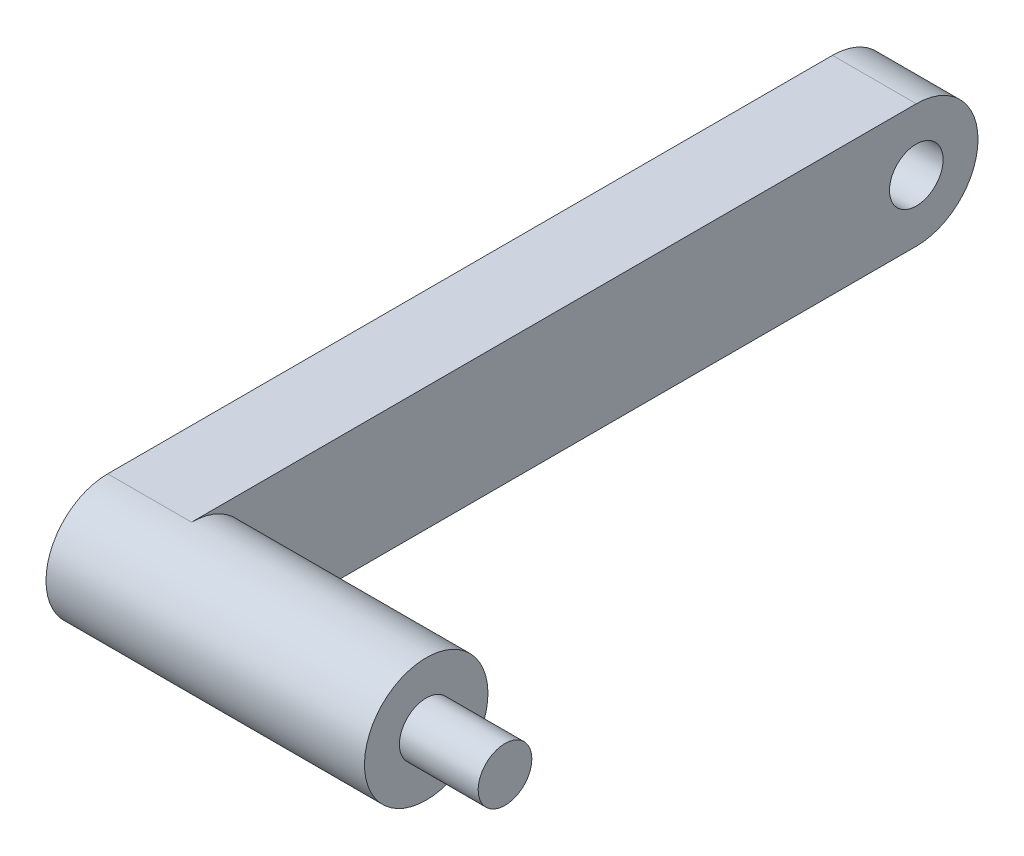
ISO-10303-21;
HEADER;
FILE_DESCRIPTION(('STEP AP214'),'2;1');
FILE_NAME('part.step','',(''),(''),'','','');
FILE_SCHEMA(('AUTOMOTIVE_DESIGN { 1 0 10303 214 1 1 1 1 }'));
ENDSEC;
DATA;
#1=APPLICATION_CONTEXT('core data for automotive mechanical design processes');
#2=APPLICATION_PROTOCOL_DEFINITION('international standard','automotive_design',2000,#1);
#3=PRODUCT_CONTEXT('',#1,'mechanical');
#4=PRODUCT('Part','Part','',(#3));
#5=PRODUCT_RELATED_PRODUCT_CATEGORY('part','',(#4));
#6=PRODUCT_DEFINITION_FORMATION('','',#4);
#7=PRODUCT_DEFINITION_CONTEXT('part definition',#1,'design');
#8=PRODUCT_DEFINITION('design','',#6,#7);
#9=PRODUCT_DEFINITION_SHAPE('','',#8);
#10=(LENGTH_UNIT() NAMED_UNIT(*) SI_UNIT(.MILLI.,.METRE.));
#11=(NAMED_UNIT(*) PLANE_ANGLE_UNIT() SI_UNIT($,.RADIAN.));
#12=(NAMED_UNIT(*) SI_UNIT($,.STERADIAN.) SOLID_ANGLE_UNIT());
#13=UNCERTAINTY_MEASURE_WITH_UNIT(LENGTH_MEASURE(1.E-05),#10,'distance_accuracy_value','');
#14=(GEOMETRIC_REPRESENTATION_CONTEXT(3) GLOBAL_UNCERTAINTY_ASSIGNED_CONTEXT((#13)) GLOBAL_UNIT_ASSIGNED_CONTEXT((#10,
#11,#12)) REPRESENTATION_CONTEXT('',''));
#15=CARTESIAN_POINT('',(0.,0.,0.));
#16=DIRECTION('',(0.,0.,1.));
#17=DIRECTION('',(1.,0.,0.));
#18=AXIS2_PLACEMENT_3D('',#15,#16,#17);
#19=CARTESIAN_POINT('',(-19.,0.,38.66));
#20=DIRECTION('',(1.,0.,0.));
#21=DIRECTION('',(0.,0.,-1.));
#22=AXIS2_PLACEMENT_3D('',#19,#20,#21);
#23=CYLINDRICAL_SURFACE('',#22,1.6);
#24=CARTESIAN_POINT('',(-19.,0.,38.66));
#25=DIRECTION('',(1.,0.,0.));
#26=DIRECTION('',(0.,0.,-1.));
#27=AXIS2_PLACEMENT_3D('',#24,#25,#26);
#28=CIRCLE('',#27,1.6);
#29=CARTESIAN_POINT('',(-19.,0.,37.06));
#30=VERTEX_POINT('',#29);
#31=EDGE_CURVE('E123',#30,#30,#28,.T.);
#32=ORIENTED_EDGE('',*,*,#31,.F.);
#33=EDGE_LOOP('',(#32));
#34=FACE_BOUND('',#33,.T.);
#35=CARTESIAN_POINT('',(-14.,0.,38.66));
#36=DIRECTION('',(1.,0.,0.));
#37=DIRECTION('',(0.,0.,-1.));
#38=AXIS2_PLACEMENT_3D('',#35,#36,#37);
#39=CIRCLE('',#38,1.6);
#40=CARTESIAN_POINT('',(-14.,0.,37.06));
#41=VERTEX_POINT('',#40);
#42=EDGE_CURVE('E12',#41,#41,#39,.F.);
#43=ORIENTED_EDGE('',*,*,#42,.F.);
#44=EDGE_LOOP('',(#43));
#45=FACE_BOUND('',#44,.T.);
#46=ADVANCED_FACE('F50',(#34,#45),#23,.F.);
#47=CARTESIAN_POINT('',(-19.,-3.68146636835648,-9.15));
#48=DIRECTION('',(0.,1.,0.));
#49=DIRECTION('',(0.,0.,1.));
#50=AXIS2_PLACEMENT_3D('',#47,#48,#49);
#51=PLANE('',#50);
#52=DIRECTION('',(0.,0.,1.));
#53=VECTOR('',#52,1.);
#54=CARTESIAN_POINT('',(-14.,-3.68146636835648,-9.15));
#55=LINE('',#54,#53);
#56=CARTESIAN_POINT('',(-14.,-3.68146636835648,-4.57499999999999));
#57=VERTEX_POINT('',#56);
#58=CARTESIAN_POINT('',(-14.,-3.68146636835648,38.66));
#59=VERTEX_POINT('',#58);
#60=EDGE_CURVE('E105',#57,#59,#55,.T.);
#61=ORIENTED_EDGE('',*,*,#60,.T.);
#62=DIRECTION('',(1.,0.,0.));
#63=VECTOR('',#62,1.);
#64=CARTESIAN_POINT('',(-19.,-3.68146636835648,38.66));
#65=LINE('',#64,#63);
#66=CARTESIAN_POINT('',(-19.,-3.68146636835648,38.66));
#67=VERTEX_POINT('',#66);
#68=EDGE_CURVE('E112',#67,#59,#65,.T.);
#69=ORIENTED_EDGE('',*,*,#68,.F.);
#70=DIRECTION('',(0.,0.,1.));
#71=VECTOR('',#70,1.);
#72=CARTESIAN_POINT('',(-19.,-3.68146636835648,-9.15));
#73=LINE('',#72,#71);
#74=CARTESIAN_POINT('',(-19.,-3.68146636835648,-4.57499999999999));
#75=VERTEX_POINT('',#74);
#76=EDGE_CURVE('E87',#75,#67,#73,.T.);
#77=ORIENTED_EDGE('',*,*,#76,.F.);
#78=DIRECTION('',(1.,0.,0.));
#79=VECTOR('',#78,1.);
#80=CARTESIAN_POINT('',(-19.,-3.68146636835648,-4.57499999999999));
#81=LINE('',#80,#79);
#82=EDGE_CURVE('E61',#75,#57,#81,.T.);
#83=ORIENTED_EDGE('',*,*,#82,.T.);
#84=EDGE_LOOP('',(#61,#69,#77,#83));
#85=FACE_BOUND('',#84,.T.);
#86=ADVANCED_FACE('F47',(#85),#51,.F.);
#87=CARTESIAN_POINT('',(-19.,0.,38.66));
#88=DIRECTION('',(1.,0.,0.));
#89=DIRECTION('',(0.,0.,-1.));
#90=AXIS2_PLACEMENT_3D('',#87,#88,#89);
#91=CYLINDRICAL_SURFACE('',#90,3.68146636835648);
#92=ORIENTED_EDGE('',*,*,#68,.T.);
#93=CARTESIAN_POINT('',(-14.,0.,38.66));
#94=DIRECTION('',(1.,0.,0.));
#95=DIRECTION('',(0.,0.,-1.));
#96=AXIS2_PLACEMENT_3D('',#93,#94,#95);
#97=CIRCLE('',#96,3.68146636835647);
#98=CARTESIAN_POINT('',(-14.,3.68146636835647,38.66));
#99=VERTEX_POINT('',#98);
#100=EDGE_CURVE('E57',#59,#99,#97,.T.);
#101=ORIENTED_EDGE('',*,*,#100,.T.);
#102=DIRECTION('',(1.,0.,0.));
#103=VECTOR('',#102,1.);
#104=CARTESIAN_POINT('',(-19.,3.68146636835648,38.66));
#105=LINE('',#104,#103);
#106=CARTESIAN_POINT('',(-19.,3.68146636835648,38.66));
#107=VERTEX_POINT('',#106);
#108=EDGE_CURVE('E104',#107,#99,#105,.T.);
#109=ORIENTED_EDGE('',*,*,#108,.F.);
#110=CARTESIAN_POINT('',(-19.,0.,38.66));
#111=DIRECTION('',(1.,0.,0.));
#112=DIRECTION('',(0.,0.,-1.));
#113=AXIS2_PLACEMENT_3D('',#110,#111,#112);
#114=CIRCLE('',#113,3.68146636835648);
#115=EDGE_CURVE('E135',#107,#67,#114,.T.);
#116=ORIENTED_EDGE('',*,*,#115,.T.);
#117=EDGE_LOOP('',(#92,#101,#109,#116));
#118=FACE_BOUND('',#117,.T.);
#119=CARTESIAN_POINT('',(0.,0.,38.66));
#120=DIRECTION('',(-1.,0.,0.));
#121=DIRECTION('',(0.,-1.,0.));
#122=AXIS2_PLACEMENT_3D('',#119,#120,#121);
#123=CIRCLE('',#122,3.68146636835647);
#124=CARTESIAN_POINT('',(0.,-3.68146636835647,38.66));
#125=VERTEX_POINT('',#124);
#126=EDGE_CURVE('E121',#125,#125,#123,.T.);
#127=ORIENTED_EDGE('',*,*,#126,.T.);
#128=EDGE_LOOP('',(#127));
#129=FACE_BOUND('',#128,.T.);
#130=ADVANCED_FACE('F114',(#118,#129),#91,.T.);
#131=CARTESIAN_POINT('',(-19.,3.68146636835648,-9.15));
#132=DIRECTION('',(0.,1.,0.));
#133=DIRECTION('',(0.,0.,1.));
#134=AXIS2_PLACEMENT_3D('',#131,#132,#133);
#135=PLANE('',#134);
#136=DIRECTION('',(0.,0.,1.));
#137=VECTOR('',#136,1.);
#138=CARTESIAN_POINT('',(-14.,3.68146636835648,-9.15));
#139=LINE('',#138,#137);
#140=CARTESIAN_POINT('',(-14.,3.68146636835648,-4.57499999999999));
#141=VERTEX_POINT('',#140);
#142=EDGE_CURVE('E94',#141,#99,#139,.T.);
#143=ORIENTED_EDGE('',*,*,#142,.F.);
#144=DIRECTION('',(1.,0.,0.));
#145=VECTOR('',#144,1.);
#146=CARTESIAN_POINT('',(-19.,3.68146636835648,-4.57499999999999));
#147=LINE('',#146,#145);
#148=CARTESIAN_POINT('',(-19.,3.68146636835648,-4.57499999999999));
#149=VERTEX_POINT('',#148);
#150=EDGE_CURVE('E77',#149,#141,#147,.T.);
#151=ORIENTED_EDGE('',*,*,#150,.F.);
#152=DIRECTION('',(0.,0.,1.));
#153=VECTOR('',#152,1.);
#154=CARTESIAN_POINT('',(-19.,3.68146636835648,-9.15));
#155=LINE('',#154,#153);
#156=EDGE_CURVE('E107',#149,#107,#155,.T.);
#157=ORIENTED_EDGE('',*,*,#156,.T.);
#158=ORIENTED_EDGE('',*,*,#108,.T.);
#159=EDGE_LOOP('',(#143,#151,#157,#158));
#160=FACE_BOUND('',#159,.T.);
#161=ADVANCED_FACE('F106',(#160),#135,.T.);
#162=CARTESIAN_POINT('',(-19.,0.,-4.57499999999999));
#163=DIRECTION('',(1.,0.,0.));
#164=DIRECTION('',(0.,0.,-1.));
#165=AXIS2_PLACEMENT_3D('',#162,#163,#164);
#166=CYLINDRICAL_SURFACE('',#165,3.68146636835648);
#167=CARTESIAN_POINT('',(-14.,0.,-4.57499999999999));
#168=DIRECTION('',(1.,0.,0.));
#169=DIRECTION('',(0.,0.,-1.));
#170=AXIS2_PLACEMENT_3D('',#167,#168,#169);
#171=CIRCLE('',#170,3.68146636835648);
#172=EDGE_CURVE('E99',#57,#141,#171,.T.);
#173=ORIENTED_EDGE('',*,*,#172,.F.);
#174=ORIENTED_EDGE('',*,*,#82,.F.);
#175=CARTESIAN_POINT('',(-19.,0.,-4.57499999999999));
#176=DIRECTION('',(1.,0.,0.));
#177=DIRECTION('',(0.,0.,-1.));
#178=AXIS2_PLACEMENT_3D('',#175,#176,#177);
#179=CIRCLE('',#178,3.68146636835648);
#180=EDGE_CURVE('E133',#75,#149,#179,.T.);
#181=ORIENTED_EDGE('',*,*,#180,.T.);
#182=ORIENTED_EDGE('',*,*,#150,.T.);
#183=EDGE_LOOP('',(#173,#174,#181,#182));
#184=FACE_BOUND('',#183,.T.);
#185=ADVANCED_FACE('F152',(#184),#166,.T.);
#186=CARTESIAN_POINT('',(-19.,0.,38.66));
#187=DIRECTION('',(1.,0.,0.));
#188=DIRECTION('',(0.,0.,-1.));
#189=AXIS2_PLACEMENT_3D('',#186,#187,#188);
#190=PLANE('',#189);
#191=CARTESIAN_POINT('',(-19.,0.,-4.57499999999999));
#192=DIRECTION('',(1.,0.,0.));
#193=DIRECTION('',(0.,0.,-1.));
#194=AXIS2_PLACEMENT_3D('',#191,#192,#193);
#195=CIRCLE('',#194,1.6);
#196=CARTESIAN_POINT('',(-19.,0.,-6.17499999999999));
#197=VERTEX_POINT('',#196);
#198=EDGE_CURVE('E124',#197,#197,#195,.T.);
#199=ORIENTED_EDGE('',*,*,#198,.T.);
#200=EDGE_LOOP('',(#199));
#201=FACE_BOUND('',#200,.T.);
#202=ORIENTED_EDGE('',*,*,#31,.T.);
#203=EDGE_LOOP('',(#202));
#204=FACE_BOUND('',#203,.T.);
#205=ORIENTED_EDGE('',*,*,#76,.T.);
#206=ORIENTED_EDGE('',*,*,#115,.F.);
#207=ORIENTED_EDGE('',*,*,#156,.F.);
#208=ORIENTED_EDGE('',*,*,#180,.F.);
#209=EDGE_LOOP('',(#205,#206,#207,#208));
#210=FACE_BOUND('',#209,.T.);
#211=ADVANCED_FACE('F148',(#201,#204,#210),#190,.F.);
#212=CARTESIAN_POINT('',(-14.,0.,38.66));
#213=DIRECTION('',(1.,0.,0.));
#214=DIRECTION('',(0.,0.,-1.));
#215=AXIS2_PLACEMENT_3D('',#212,#213,#214);
#216=PLANE('',#215);
#217=ORIENTED_EDGE('',*,*,#100,.F.);
#218=ORIENTED_EDGE('',*,*,#60,.F.);
#219=ORIENTED_EDGE('',*,*,#172,.T.);
#220=ORIENTED_EDGE('',*,*,#142,.T.);
#221=EDGE_LOOP('',(#217,#218,#219,#220));
#222=FACE_BOUND('',#221,.T.);
#223=CARTESIAN_POINT('',(-14.,0.,-4.57499999999999));
#224=DIRECTION('',(1.,0.,0.));
#225=DIRECTION('',(0.,0.,-1.));
#226=AXIS2_PLACEMENT_3D('',#223,#224,#225);
#227=CIRCLE('',#226,1.6);
#228=CARTESIAN_POINT('',(-14.,0.,-6.17499999999999));
#229=VERTEX_POINT('',#228);
#230=EDGE_CURVE('E126',#229,#229,#227,.T.);
#231=ORIENTED_EDGE('',*,*,#230,.F.);
#232=EDGE_LOOP('',(#231));
#233=FACE_BOUND('',#232,.T.);
#234=ADVANCED_FACE('F96',(#222,#233),#216,.T.);
#235=CARTESIAN_POINT('',(-19.,0.,-4.57499999999999));
#236=DIRECTION('',(1.,0.,0.));
#237=DIRECTION('',(0.,0.,-1.));
#238=AXIS2_PLACEMENT_3D('',#235,#236,#237);
#239=CYLINDRICAL_SURFACE('',#238,1.6);
#240=ORIENTED_EDGE('',*,*,#230,.T.);
#241=EDGE_LOOP('',(#240));
#242=FACE_BOUND('',#241,.T.);
#243=ORIENTED_EDGE('',*,*,#198,.F.);
#244=EDGE_LOOP('',(#243));
#245=FACE_BOUND('',#244,.T.);
#246=ADVANCED_FACE('F141',(#242,#245),#239,.F.);
#247=CARTESIAN_POINT('',(0.,0.,21.86));
#248=DIRECTION('',(-1.,0.,0.));
#249=DIRECTION('',(0.,-1.,0.));
#250=AXIS2_PLACEMENT_3D('',#247,#248,#249);
#251=PLANE('',#250);
#252=CARTESIAN_POINT('',(0.,0.,38.66));
#253=DIRECTION('',(-1.,0.,0.));
#254=DIRECTION('',(0.,-1.,0.));
#255=AXIS2_PLACEMENT_3D('',#252,#253,#254);
#256=CIRCLE('',#255,1.6);
#257=CARTESIAN_POINT('',(0.,-1.6,38.66));
#258=VERTEX_POINT('',#257);
#259=EDGE_CURVE('E116',#258,#258,#256,.T.);
#260=ORIENTED_EDGE('',*,*,#259,.T.);
#261=EDGE_LOOP('',(#260));
#262=FACE_BOUND('',#261,.T.);
#263=ORIENTED_EDGE('',*,*,#126,.F.);
#264=EDGE_LOOP('',(#263));
#265=FACE_BOUND('',#264,.T.);
#266=ADVANCED_FACE('F155',(#262,#265),#251,.F.);
#267=CARTESIAN_POINT('',(4.7,-0.8,41.86));
#268=DIRECTION('',(-1.,0.,0.));
#269=DIRECTION('',(0.,-1.,0.));
#270=AXIS2_PLACEMENT_3D('',#267,#268,#269);
#271=PLANE('',#270);
#272=CARTESIAN_POINT('',(4.7,0.,38.66));
#273=DIRECTION('',(-1.,0.,0.));
#274=DIRECTION('',(0.,-1.,0.));
#275=AXIS2_PLACEMENT_3D('',#272,#273,#274);
#276=CIRCLE('',#275,1.6);
#277=CARTESIAN_POINT('',(4.7,-1.6,38.66));
#278=VERTEX_POINT('',#277);
#279=EDGE_CURVE('E183',#278,#278,#276,.F.);
#280=ORIENTED_EDGE('',*,*,#279,.T.);
#281=EDGE_LOOP('',(#280));
#282=FACE_BOUND('',#281,.T.);
#283=ADVANCED_FACE('F166',(#282),#271,.F.);
#284=CARTESIAN_POINT('',(9.22548339959389,0.,38.66));
#285=DIRECTION('',(-1.,0.,0.));
#286=DIRECTION('',(0.,0.,1.));
#287=AXIS2_PLACEMENT_3D('',#284,#285,#286);
#288=CYLINDRICAL_SURFACE('',#287,1.6);
#289=ORIENTED_EDGE('',*,*,#279,.F.);
#290=EDGE_LOOP('',(#289));
#291=FACE_BOUND('',#290,.T.);
#292=ORIENTED_EDGE('',*,*,#259,.F.);
#293=EDGE_LOOP('',(#292));
#294=FACE_BOUND('',#293,.T.);
#295=ADVANCED_FACE('F172',(#291,#294),#288,.T.);
#296=CARTESIAN_POINT('',(-14.,0.,0.));
#297=DIRECTION('',(1.,0.,0.));
#298=DIRECTION('',(0.,0.,-1.));
#299=AXIS2_PLACEMENT_3D('',#296,#297,#298);
#300=PLANE('',#299);
#301=ORIENTED_EDGE('',*,*,#42,.T.);
#302=EDGE_LOOP('',(#301));
#303=FACE_BOUND('',#302,.T.);
#304=ADVANCED_FACE('F171',(#303),#300,.F.);
#305=CLOSED_SHELL('',(#46,#86,#130,#161,#185,#211,#234,#246,#266,#283,#295,#304));
#306=MANIFOLD_SOLID_BREP('B2',#305);
#307=ADVANCED_BREP_SHAPE_REPRESENTATION('',(#18,#306),#14);
#308=SHAPE_DEFINITION_REPRESENTATION(#9,#307);
ENDSEC;
END-ISO-10303-21;
